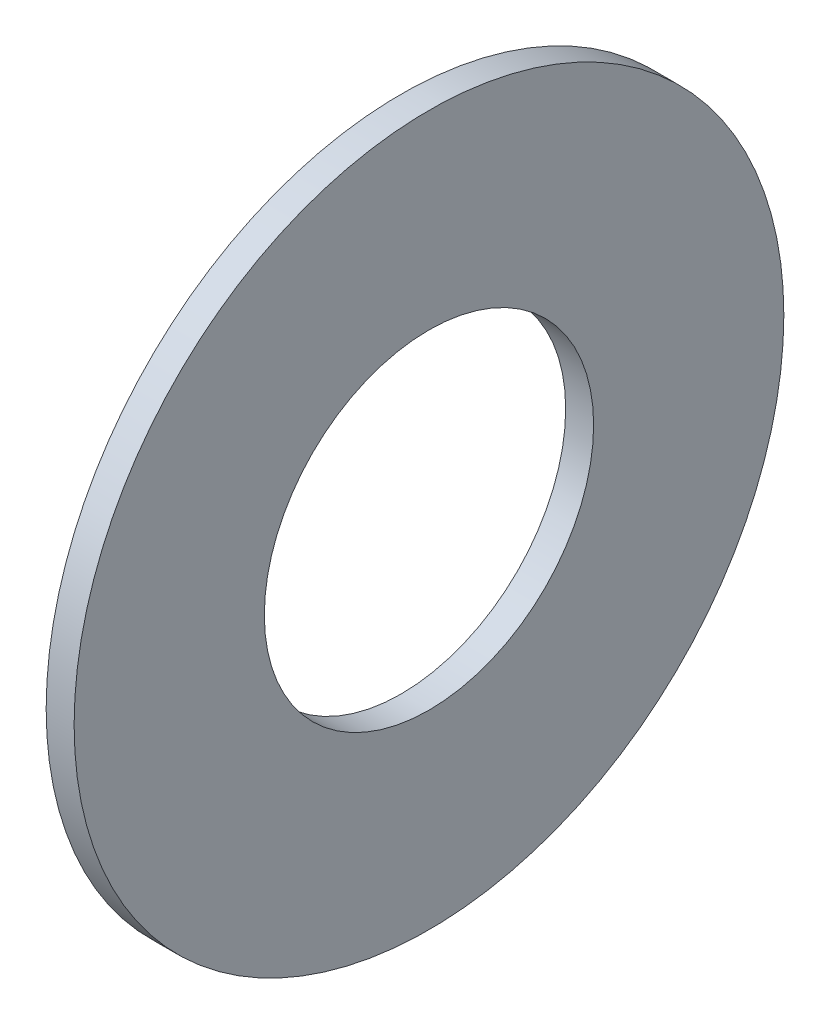
ISO-10303-21;
HEADER;
FILE_DESCRIPTION(('STEP AP214'),'2;1');
FILE_NAME('part.step','',(''),(''),'','','');
FILE_SCHEMA(('AUTOMOTIVE_DESIGN { 1 0 10303 214 1 1 1 1 }'));
ENDSEC;
DATA;
#1=APPLICATION_CONTEXT('core data for automotive mechanical design processes');
#2=APPLICATION_PROTOCOL_DEFINITION('international standard','automotive_design',2000,#1);
#3=PRODUCT_CONTEXT('',#1,'mechanical');
#4=PRODUCT('Part','Part','',(#3));
#5=PRODUCT_RELATED_PRODUCT_CATEGORY('part','',(#4));
#6=PRODUCT_DEFINITION_FORMATION('','',#4);
#7=PRODUCT_DEFINITION_CONTEXT('part definition',#1,'design');
#8=PRODUCT_DEFINITION('design','',#6,#7);
#9=PRODUCT_DEFINITION_SHAPE('','',#8);
#10=(LENGTH_UNIT() NAMED_UNIT(*) SI_UNIT(.MILLI.,.METRE.));
#11=(NAMED_UNIT(*) PLANE_ANGLE_UNIT() SI_UNIT($,.RADIAN.));
#12=(NAMED_UNIT(*) SI_UNIT($,.STERADIAN.) SOLID_ANGLE_UNIT());
#13=UNCERTAINTY_MEASURE_WITH_UNIT(LENGTH_MEASURE(1.E-05),#10,'distance_accuracy_value','');
#14=(GEOMETRIC_REPRESENTATION_CONTEXT(3) GLOBAL_UNCERTAINTY_ASSIGNED_CONTEXT((#13)) GLOBAL_UNIT_ASSIGNED_CONTEXT((#10,
#11,#12)) REPRESENTATION_CONTEXT('',''));
#15=CARTESIAN_POINT('',(0.,0.,0.));
#16=DIRECTION('',(0.,0.,1.));
#17=DIRECTION('',(1.,0.,0.));
#18=AXIS2_PLACEMENT_3D('',#15,#16,#17);
#19=CARTESIAN_POINT('',(0.4064,0.,0.));
#20=DIRECTION('',(1.,0.,0.));
#21=DIRECTION('',(0.,0.,-1.));
#22=AXIS2_PLACEMENT_3D('',#19,#20,#21);
#23=PLANE('',#22);
#24=CARTESIAN_POINT('',(0.4064,0.,0.));
#25=DIRECTION('',(1.,0.,0.));
#26=DIRECTION('',(0.,0.,-1.));
#27=AXIS2_PLACEMENT_3D('',#24,#25,#26);
#28=CIRCLE('',#27,10.31875);
#29=CARTESIAN_POINT('',(0.4064,0.,-10.31875));
#30=VERTEX_POINT('',#29);
#31=EDGE_CURVE('E10',#30,#30,#28,.T.);
#32=ORIENTED_EDGE('',*,*,#31,.T.);
#33=EDGE_LOOP('',(#32));
#34=FACE_BOUND('',#33,.T.);
#35=CARTESIAN_POINT('',(0.4064,0.,0.));
#36=DIRECTION('',(1.,0.,0.));
#37=DIRECTION('',(0.,0.,-1.));
#38=AXIS2_PLACEMENT_3D('',#35,#36,#37);
#39=CIRCLE('',#38,4.7879);
#40=CARTESIAN_POINT('',(0.4064,0.,-4.7879));
#41=VERTEX_POINT('',#40);
#42=EDGE_CURVE('E44',#41,#41,#39,.T.);
#43=ORIENTED_EDGE('',*,*,#42,.F.);
#44=EDGE_LOOP('',(#43));
#45=FACE_BOUND('',#44,.T.);
#46=ADVANCED_FACE('F33',(#34,#45),#23,.T.);
#47=CARTESIAN_POINT('',(-0.4064,0.,0.));
#48=DIRECTION('',(1.,0.,0.));
#49=DIRECTION('',(0.,0.,-1.));
#50=AXIS2_PLACEMENT_3D('',#47,#48,#49);
#51=PLANE('',#50);
#52=CARTESIAN_POINT('',(-0.4064,0.,0.));
#53=DIRECTION('',(1.,0.,0.));
#54=DIRECTION('',(0.,0.,-1.));
#55=AXIS2_PLACEMENT_3D('',#52,#53,#54);
#56=CIRCLE('',#55,10.31875);
#57=CARTESIAN_POINT('',(-0.4064,0.,-10.31875));
#58=VERTEX_POINT('',#57);
#59=EDGE_CURVE('E37',#58,#58,#56,.T.);
#60=ORIENTED_EDGE('',*,*,#59,.F.);
#61=EDGE_LOOP('',(#60));
#62=FACE_BOUND('',#61,.T.);
#63=CARTESIAN_POINT('',(-0.4064,0.,0.));
#64=DIRECTION('',(1.,0.,0.));
#65=DIRECTION('',(0.,0.,-1.));
#66=AXIS2_PLACEMENT_3D('',#63,#64,#65);
#67=CIRCLE('',#66,4.7879);
#68=CARTESIAN_POINT('',(-0.4064,0.,-4.7879));
#69=VERTEX_POINT('',#68);
#70=EDGE_CURVE('E46',#69,#69,#67,.T.);
#71=ORIENTED_EDGE('',*,*,#70,.T.);
#72=EDGE_LOOP('',(#71));
#73=FACE_BOUND('',#72,.T.);
#74=ADVANCED_FACE('F56',(#62,#73),#51,.F.);
#75=CARTESIAN_POINT('',(0.4064,0.,0.));
#76=DIRECTION('',(-1.,0.,0.));
#77=DIRECTION('',(0.,0.,1.));
#78=AXIS2_PLACEMENT_3D('',#75,#76,#77);
#79=CYLINDRICAL_SURFACE('',#78,10.31875);
#80=ORIENTED_EDGE('',*,*,#31,.F.);
#81=EDGE_LOOP('',(#80));
#82=FACE_BOUND('',#81,.T.);
#83=ORIENTED_EDGE('',*,*,#59,.T.);
#84=EDGE_LOOP('',(#83));
#85=FACE_BOUND('',#84,.T.);
#86=ADVANCED_FACE('F35',(#82,#85),#79,.T.);
#87=CARTESIAN_POINT('',(0.4064,0.,0.));
#88=DIRECTION('',(-1.,0.,0.));
#89=DIRECTION('',(0.,0.,1.));
#90=AXIS2_PLACEMENT_3D('',#87,#88,#89);
#91=CYLINDRICAL_SURFACE('',#90,4.7879);
#92=ORIENTED_EDGE('',*,*,#42,.T.);
#93=EDGE_LOOP('',(#92));
#94=FACE_BOUND('',#93,.T.);
#95=ORIENTED_EDGE('',*,*,#70,.F.);
#96=EDGE_LOOP('',(#95));
#97=FACE_BOUND('',#96,.T.);
#98=ADVANCED_FACE('F52',(#94,#97),#91,.F.);
#99=CLOSED_SHELL('',(#46,#74,#86,#98));
#100=MANIFOLD_SOLID_BREP('B2',#99);
#101=ADVANCED_BREP_SHAPE_REPRESENTATION('',(#18,#100),#14);
#102=SHAPE_DEFINITION_REPRESENTATION(#9,#101);
ENDSEC;
END-ISO-10303-21;
